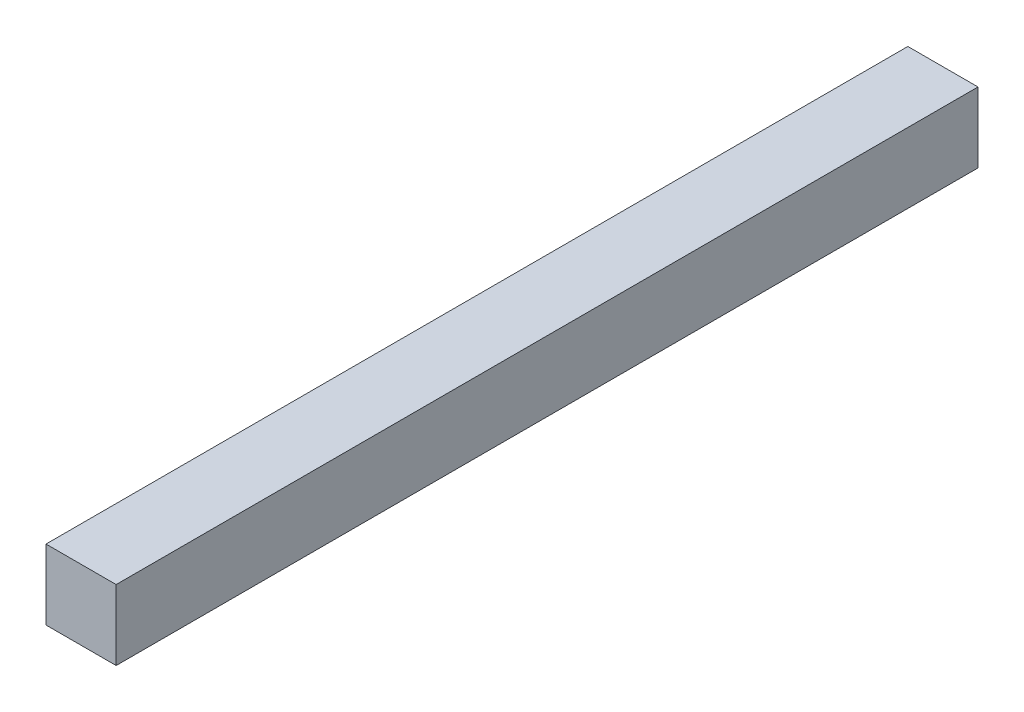
ISO-10303-21;
HEADER;
FILE_DESCRIPTION(('STEP AP214'),'2;1');
FILE_NAME('part.step','',(''),(''),'','','');
FILE_SCHEMA(('AUTOMOTIVE_DESIGN { 1 0 10303 214 1 1 1 1 }'));
ENDSEC;
DATA;
#1=APPLICATION_CONTEXT('core data for automotive mechanical design processes');
#2=APPLICATION_PROTOCOL_DEFINITION('international standard','automotive_design',2000,#1);
#3=PRODUCT_CONTEXT('',#1,'mechanical');
#4=PRODUCT('Part','Part','',(#3));
#5=PRODUCT_RELATED_PRODUCT_CATEGORY('part','',(#4));
#6=PRODUCT_DEFINITION_FORMATION('','',#4);
#7=PRODUCT_DEFINITION_CONTEXT('part definition',#1,'design');
#8=PRODUCT_DEFINITION('design','',#6,#7);
#9=PRODUCT_DEFINITION_SHAPE('','',#8);
#10=(LENGTH_UNIT() NAMED_UNIT(*) SI_UNIT(.MILLI.,.METRE.));
#11=(NAMED_UNIT(*) PLANE_ANGLE_UNIT() SI_UNIT($,.RADIAN.));
#12=(NAMED_UNIT(*) SI_UNIT($,.STERADIAN.) SOLID_ANGLE_UNIT());
#13=UNCERTAINTY_MEASURE_WITH_UNIT(LENGTH_MEASURE(1.E-05),#10,'distance_accuracy_value','');
#14=(GEOMETRIC_REPRESENTATION_CONTEXT(3) GLOBAL_UNCERTAINTY_ASSIGNED_CONTEXT((#13)) GLOBAL_UNIT_ASSIGNED_CONTEXT((#10,
#11,#12)) REPRESENTATION_CONTEXT('',''));
#15=CARTESIAN_POINT('',(0.,0.,0.));
#16=DIRECTION('',(0.,0.,1.));
#17=DIRECTION('',(1.,0.,0.));
#18=AXIS2_PLACEMENT_3D('',#15,#16,#17);
#19=CARTESIAN_POINT('',(0.,0.,860.));
#20=DIRECTION('',(1.,0.,0.));
#21=DIRECTION('',(0.,0.,-1.));
#22=AXIS2_PLACEMENT_3D('',#19,#20,#21);
#23=PLANE('',#22);
#24=DIRECTION('',(0.,-1.,0.));
#25=VECTOR('',#24,1.);
#26=CARTESIAN_POINT('',(0.,0.,0.));
#27=LINE('',#26,#25);
#28=CARTESIAN_POINT('',(0.,70.,0.));
#29=VERTEX_POINT('',#28);
#30=CARTESIAN_POINT('',(0.,0.,0.));
#31=VERTEX_POINT('',#30);
#32=EDGE_CURVE('E96',#29,#31,#27,.T.);
#33=ORIENTED_EDGE('',*,*,#32,.T.);
#34=DIRECTION('',(0.,0.,-1.));
#35=VECTOR('',#34,1.);
#36=CARTESIAN_POINT('',(0.,0.,860.));
#37=LINE('',#36,#35);
#38=CARTESIAN_POINT('',(0.,0.,860.));
#39=VERTEX_POINT('',#38);
#40=EDGE_CURVE('E11',#39,#31,#37,.T.);
#41=ORIENTED_EDGE('',*,*,#40,.F.);
#42=DIRECTION('',(0.,-1.,0.));
#43=VECTOR('',#42,1.);
#44=CARTESIAN_POINT('',(0.,0.,860.));
#45=LINE('',#44,#43);
#46=CARTESIAN_POINT('',(0.,70.,860.));
#47=VERTEX_POINT('',#46);
#48=EDGE_CURVE('E84',#47,#39,#45,.T.);
#49=ORIENTED_EDGE('',*,*,#48,.F.);
#50=DIRECTION('',(0.,0.,-1.));
#51=VECTOR('',#50,1.);
#52=CARTESIAN_POINT('',(0.,70.,860.));
#53=LINE('',#52,#51);
#54=EDGE_CURVE('E92',#47,#29,#53,.T.);
#55=ORIENTED_EDGE('',*,*,#54,.T.);
#56=EDGE_LOOP('',(#33,#41,#49,#55));
#57=FACE_BOUND('',#56,.T.);
#58=ADVANCED_FACE('F33',(#57),#23,.F.);
#59=CARTESIAN_POINT('',(0.,0.,860.));
#60=DIRECTION('',(0.,1.,0.));
#61=DIRECTION('',(0.,0.,1.));
#62=AXIS2_PLACEMENT_3D('',#59,#60,#61);
#63=PLANE('',#62);
#64=DIRECTION('',(1.,0.,0.));
#65=VECTOR('',#64,1.);
#66=CARTESIAN_POINT('',(0.,0.,0.));
#67=LINE('',#66,#65);
#68=CARTESIAN_POINT('',(70.,0.,0.));
#69=VERTEX_POINT('',#68);
#70=EDGE_CURVE('E88',#31,#69,#67,.T.);
#71=ORIENTED_EDGE('',*,*,#70,.T.);
#72=DIRECTION('',(0.,0.,-1.));
#73=VECTOR('',#72,1.);
#74=CARTESIAN_POINT('',(70.,0.,860.));
#75=LINE('',#74,#73);
#76=CARTESIAN_POINT('',(70.,0.,860.));
#77=VERTEX_POINT('',#76);
#78=EDGE_CURVE('E41',#77,#69,#75,.T.);
#79=ORIENTED_EDGE('',*,*,#78,.F.);
#80=DIRECTION('',(1.,0.,0.));
#81=VECTOR('',#80,1.);
#82=CARTESIAN_POINT('',(0.,0.,860.));
#83=LINE('',#82,#81);
#84=EDGE_CURVE('E79',#39,#77,#83,.T.);
#85=ORIENTED_EDGE('',*,*,#84,.F.);
#86=ORIENTED_EDGE('',*,*,#40,.T.);
#87=EDGE_LOOP('',(#71,#79,#85,#86));
#88=FACE_BOUND('',#87,.T.);
#89=ADVANCED_FACE('F87',(#88),#63,.F.);
#90=CARTESIAN_POINT('',(70.,0.,860.));
#91=DIRECTION('',(-1.,0.,0.));
#92=DIRECTION('',(0.,0.,1.));
#93=AXIS2_PLACEMENT_3D('',#90,#91,#92);
#94=PLANE('',#93);
#95=DIRECTION('',(0.,1.,0.));
#96=VECTOR('',#95,1.);
#97=CARTESIAN_POINT('',(70.,0.,0.));
#98=LINE('',#97,#96);
#99=CARTESIAN_POINT('',(70.,70.,0.));
#100=VERTEX_POINT('',#99);
#101=EDGE_CURVE('E66',#69,#100,#98,.T.);
#102=ORIENTED_EDGE('',*,*,#101,.T.);
#103=DIRECTION('',(0.,0.,-1.));
#104=VECTOR('',#103,1.);
#105=CARTESIAN_POINT('',(70.,70.,860.));
#106=LINE('',#105,#104);
#107=CARTESIAN_POINT('',(70.,70.,860.));
#108=VERTEX_POINT('',#107);
#109=EDGE_CURVE('E89',#108,#100,#106,.T.);
#110=ORIENTED_EDGE('',*,*,#109,.F.);
#111=DIRECTION('',(0.,1.,0.));
#112=VECTOR('',#111,1.);
#113=CARTESIAN_POINT('',(70.,0.,860.));
#114=LINE('',#113,#112);
#115=EDGE_CURVE('E82',#77,#108,#114,.T.);
#116=ORIENTED_EDGE('',*,*,#115,.F.);
#117=ORIENTED_EDGE('',*,*,#78,.T.);
#118=EDGE_LOOP('',(#102,#110,#116,#117));
#119=FACE_BOUND('',#118,.T.);
#120=ADVANCED_FACE('F90',(#119),#94,.F.);
#121=CARTESIAN_POINT('',(0.,70.,860.));
#122=DIRECTION('',(0.,-1.,0.));
#123=DIRECTION('',(0.,0.,-1.));
#124=AXIS2_PLACEMENT_3D('',#121,#122,#123);
#125=PLANE('',#124);
#126=DIRECTION('',(-1.,0.,0.));
#127=VECTOR('',#126,1.);
#128=CARTESIAN_POINT('',(0.,70.,0.));
#129=LINE('',#128,#127);
#130=EDGE_CURVE('E72',#100,#29,#129,.T.);
#131=ORIENTED_EDGE('',*,*,#130,.T.);
#132=ORIENTED_EDGE('',*,*,#54,.F.);
#133=DIRECTION('',(-1.,0.,0.));
#134=VECTOR('',#133,1.);
#135=CARTESIAN_POINT('',(0.,70.,860.));
#136=LINE('',#135,#134);
#137=EDGE_CURVE('E49',#108,#47,#136,.T.);
#138=ORIENTED_EDGE('',*,*,#137,.F.);
#139=ORIENTED_EDGE('',*,*,#109,.T.);
#140=EDGE_LOOP('',(#131,#132,#138,#139));
#141=FACE_BOUND('',#140,.T.);
#142=ADVANCED_FACE('F104',(#141),#125,.F.);
#143=CARTESIAN_POINT('',(0.,0.,860.));
#144=DIRECTION('',(0.,0.,-1.));
#145=DIRECTION('',(-1.,0.,0.));
#146=AXIS2_PLACEMENT_3D('',#143,#144,#145);
#147=PLANE('',#146);
#148=ORIENTED_EDGE('',*,*,#48,.T.);
#149=ORIENTED_EDGE('',*,*,#84,.T.);
#150=ORIENTED_EDGE('',*,*,#115,.T.);
#151=ORIENTED_EDGE('',*,*,#137,.T.);
#152=EDGE_LOOP('',(#148,#149,#150,#151));
#153=FACE_BOUND('',#152,.T.);
#154=ADVANCED_FACE('F80',(#153),#147,.F.);
#155=CARTESIAN_POINT('',(0.,0.,0.));
#156=DIRECTION('',(0.,0.,-1.));
#157=DIRECTION('',(-1.,0.,0.));
#158=AXIS2_PLACEMENT_3D('',#155,#156,#157);
#159=PLANE('',#158);
#160=CARTESIAN_POINT('',(35.,35.,0.));
#161=DIRECTION('',(0.,0.,-1.));
#162=DIRECTION('',(-1.,0.,0.));
#163=AXIS2_PLACEMENT_3D('',#160,#161,#162);
#164=CIRCLE('',#163,6.);
#165=CARTESIAN_POINT('',(29.,35.,0.));
#166=VERTEX_POINT('',#165);
#167=EDGE_CURVE('E110',#166,#166,#164,.T.);
#168=ORIENTED_EDGE('',*,*,#167,.F.);
#169=EDGE_LOOP('',(#168));
#170=FACE_BOUND('',#169,.T.);
#171=ORIENTED_EDGE('',*,*,#32,.F.);
#172=ORIENTED_EDGE('',*,*,#130,.F.);
#173=ORIENTED_EDGE('',*,*,#101,.F.);
#174=ORIENTED_EDGE('',*,*,#70,.F.);
#175=EDGE_LOOP('',(#171,#172,#173,#174));
#176=FACE_BOUND('',#175,.T.);
#177=ADVANCED_FACE('F107',(#170,#176),#159,.T.);
#178=CARTESIAN_POINT('',(35.,35.,80.));
#179=DIRECTION('',(0.,0.,-1.));
#180=DIRECTION('',(-1.,0.,0.));
#181=AXIS2_PLACEMENT_3D('',#178,#179,#180);
#182=CYLINDRICAL_SURFACE('',#181,6.);
#183=CARTESIAN_POINT('',(35.,35.,80.));
#184=DIRECTION('',(0.,0.,-1.));
#185=DIRECTION('',(-1.,0.,0.));
#186=AXIS2_PLACEMENT_3D('',#183,#184,#185);
#187=CIRCLE('',#186,6.);
#188=CARTESIAN_POINT('',(29.,35.,80.));
#189=VERTEX_POINT('',#188);
#190=EDGE_CURVE('E99',#189,#189,#187,.T.);
#191=ORIENTED_EDGE('',*,*,#190,.F.);
#192=EDGE_LOOP('',(#191));
#193=FACE_BOUND('',#192,.T.);
#194=ORIENTED_EDGE('',*,*,#167,.T.);
#195=EDGE_LOOP('',(#194));
#196=FACE_BOUND('',#195,.T.);
#197=ADVANCED_FACE('F118',(#193,#196),#182,.F.);
#198=CARTESIAN_POINT('',(35.,35.,80.));
#199=DIRECTION('',(0.,0.,-1.));
#200=DIRECTION('',(-1.,0.,0.));
#201=AXIS2_PLACEMENT_3D('',#198,#199,#200);
#202=PLANE('',#201);
#203=ORIENTED_EDGE('',*,*,#190,.T.);
#204=EDGE_LOOP('',(#203));
#205=FACE_BOUND('',#204,.T.);
#206=ADVANCED_FACE('F116',(#205),#202,.T.);
#207=CLOSED_SHELL('',(#58,#89,#120,#142,#154,#177,#197,#206));
#208=MANIFOLD_SOLID_BREP('B2',#207);
#209=ADVANCED_BREP_SHAPE_REPRESENTATION('',(#18,#208),#14);
#210=SHAPE_DEFINITION_REPRESENTATION(#9,#209);
ENDSEC;
END-ISO-10303-21;
